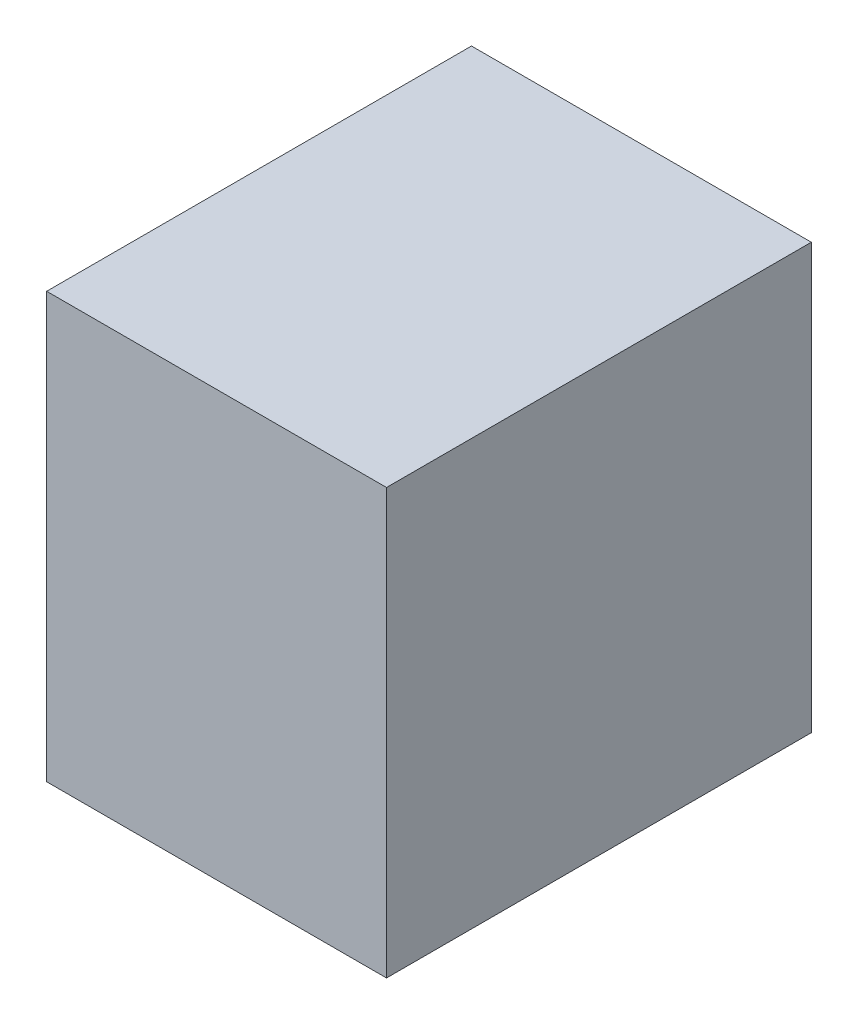
ISO-10303-21;
HEADER;
FILE_DESCRIPTION(('STEP AP214'),'2;1');
FILE_NAME('part.step','',(''),(''),'','','');
FILE_SCHEMA(('AUTOMOTIVE_DESIGN { 1 0 10303 214 1 1 1 1 }'));
ENDSEC;
DATA;
#1=APPLICATION_CONTEXT('core data for automotive mechanical design processes');
#2=APPLICATION_PROTOCOL_DEFINITION('international standard','automotive_design',2000,#1);
#3=PRODUCT_CONTEXT('',#1,'mechanical');
#4=PRODUCT('Part','Part','',(#3));
#5=PRODUCT_RELATED_PRODUCT_CATEGORY('part','',(#4));
#6=PRODUCT_DEFINITION_FORMATION('','',#4);
#7=PRODUCT_DEFINITION_CONTEXT('part definition',#1,'design');
#8=PRODUCT_DEFINITION('design','',#6,#7);
#9=PRODUCT_DEFINITION_SHAPE('','',#8);
#10=(LENGTH_UNIT() NAMED_UNIT(*) SI_UNIT(.MILLI.,.METRE.));
#11=(NAMED_UNIT(*) PLANE_ANGLE_UNIT() SI_UNIT($,.RADIAN.));
#12=(NAMED_UNIT(*) SI_UNIT($,.STERADIAN.) SOLID_ANGLE_UNIT());
#13=UNCERTAINTY_MEASURE_WITH_UNIT(LENGTH_MEASURE(1.E-05),#10,'distance_accuracy_value','');
#14=(GEOMETRIC_REPRESENTATION_CONTEXT(3) GLOBAL_UNCERTAINTY_ASSIGNED_CONTEXT((#13)) GLOBAL_UNIT_ASSIGNED_CONTEXT((#10,
#11,#12)) REPRESENTATION_CONTEXT('',''));
#15=CARTESIAN_POINT('',(0.,0.,0.));
#16=DIRECTION('',(0.,0.,1.));
#17=DIRECTION('',(1.,0.,0.));
#18=AXIS2_PLACEMENT_3D('',#15,#16,#17);
#19=CARTESIAN_POINT('',(-11.0656743384633,50.2483985750425,31.75));
#20=DIRECTION('',(1.,0.,0.));
#21=DIRECTION('',(0.,1.,0.));
#22=AXIS2_PLACEMENT_3D('',#19,#20,#21);
#23=PLANE('',#22);
#24=DIRECTION('',(0.,-1.,0.));
#25=VECTOR('',#24,1.);
#26=CARTESIAN_POINT('',(-11.0656743384633,50.2483985750425,0.));
#27=LINE('',#26,#25);
#28=CARTESIAN_POINT('',(-11.0656743384633,50.2483985750425,0.));
#29=VERTEX_POINT('',#28);
#30=CARTESIAN_POINT('',(-11.0656743384633,18.4983985750425,0.));
#31=VERTEX_POINT('',#30);
#32=EDGE_CURVE('E98',#29,#31,#27,.T.);
#33=ORIENTED_EDGE('',*,*,#32,.T.);
#34=DIRECTION('',(0.,0.,-1.));
#35=VECTOR('',#34,1.);
#36=CARTESIAN_POINT('',(-11.0656743384633,18.4983985750425,31.75));
#37=LINE('',#36,#35);
#38=CARTESIAN_POINT('',(-11.0656743384633,18.4983985750425,31.75));
#39=VERTEX_POINT('',#38);
#40=EDGE_CURVE('E11',#39,#31,#37,.T.);
#41=ORIENTED_EDGE('',*,*,#40,.F.);
#42=DIRECTION('',(0.,-1.,0.));
#43=VECTOR('',#42,1.);
#44=CARTESIAN_POINT('',(-11.0656743384633,50.2483985750425,31.75));
#45=LINE('',#44,#43);
#46=CARTESIAN_POINT('',(-11.0656743384633,50.2483985750425,31.75));
#47=VERTEX_POINT('',#46);
#48=EDGE_CURVE('E86',#47,#39,#45,.T.);
#49=ORIENTED_EDGE('',*,*,#48,.F.);
#50=DIRECTION('',(0.,0.,-1.));
#51=VECTOR('',#50,1.);
#52=CARTESIAN_POINT('',(-11.0656743384633,50.2483985750425,31.75));
#53=LINE('',#52,#51);
#54=EDGE_CURVE('E94',#47,#29,#53,.T.);
#55=ORIENTED_EDGE('',*,*,#54,.T.);
#56=EDGE_LOOP('',(#33,#41,#49,#55));
#57=FACE_BOUND('',#56,.T.);
#58=ADVANCED_FACE('F35',(#57),#23,.F.);
#59=CARTESIAN_POINT('',(-11.0656743384633,18.4983985750425,31.75));
#60=DIRECTION('',(0.,1.,0.));
#61=DIRECTION('',(0.,0.,1.));
#62=AXIS2_PLACEMENT_3D('',#59,#60,#61);
#63=PLANE('',#62);
#64=DIRECTION('',(1.,0.,0.));
#65=VECTOR('',#64,1.);
#66=CARTESIAN_POINT('',(-11.0656743384633,18.4983985750425,0.));
#67=LINE('',#66,#65);
#68=CARTESIAN_POINT('',(14.3343256615367,18.4983985750425,0.));
#69=VERTEX_POINT('',#68);
#70=EDGE_CURVE('E90',#31,#69,#67,.T.);
#71=ORIENTED_EDGE('',*,*,#70,.T.);
#72=DIRECTION('',(0.,0.,-1.));
#73=VECTOR('',#72,1.);
#74=CARTESIAN_POINT('',(14.3343256615367,18.4983985750425,31.75));
#75=LINE('',#74,#73);
#76=CARTESIAN_POINT('',(14.3343256615367,18.4983985750425,31.75));
#77=VERTEX_POINT('',#76);
#78=EDGE_CURVE('E43',#77,#69,#75,.T.);
#79=ORIENTED_EDGE('',*,*,#78,.F.);
#80=DIRECTION('',(1.,0.,0.));
#81=VECTOR('',#80,1.);
#82=CARTESIAN_POINT('',(-11.0656743384633,18.4983985750425,31.75));
#83=LINE('',#82,#81);
#84=EDGE_CURVE('E81',#39,#77,#83,.T.);
#85=ORIENTED_EDGE('',*,*,#84,.F.);
#86=ORIENTED_EDGE('',*,*,#40,.T.);
#87=EDGE_LOOP('',(#71,#79,#85,#86));
#88=FACE_BOUND('',#87,.T.);
#89=ADVANCED_FACE('F89',(#88),#63,.F.);
#90=CARTESIAN_POINT('',(14.3343256615367,50.2483985750425,31.75));
#91=DIRECTION('',(-1.,0.,0.));
#92=DIRECTION('',(0.,-1.,0.));
#93=AXIS2_PLACEMENT_3D('',#90,#91,#92);
#94=PLANE('',#93);
#95=DIRECTION('',(0.,1.,0.));
#96=VECTOR('',#95,1.);
#97=CARTESIAN_POINT('',(14.3343256615367,50.2483985750425,0.));
#98=LINE('',#97,#96);
#99=CARTESIAN_POINT('',(14.3343256615367,50.2483985750425,0.));
#100=VERTEX_POINT('',#99);
#101=EDGE_CURVE('E68',#69,#100,#98,.T.);
#102=ORIENTED_EDGE('',*,*,#101,.T.);
#103=DIRECTION('',(0.,0.,-1.));
#104=VECTOR('',#103,1.);
#105=CARTESIAN_POINT('',(14.3343256615367,50.2483985750425,31.75));
#106=LINE('',#105,#104);
#107=CARTESIAN_POINT('',(14.3343256615367,50.2483985750425,31.75));
#108=VERTEX_POINT('',#107);
#109=EDGE_CURVE('E91',#108,#100,#106,.T.);
#110=ORIENTED_EDGE('',*,*,#109,.F.);
#111=DIRECTION('',(0.,1.,0.));
#112=VECTOR('',#111,1.);
#113=CARTESIAN_POINT('',(14.3343256615367,50.2483985750425,31.75));
#114=LINE('',#113,#112);
#115=EDGE_CURVE('E84',#77,#108,#114,.T.);
#116=ORIENTED_EDGE('',*,*,#115,.F.);
#117=ORIENTED_EDGE('',*,*,#78,.T.);
#118=EDGE_LOOP('',(#102,#110,#116,#117));
#119=FACE_BOUND('',#118,.T.);
#120=ADVANCED_FACE('F92',(#119),#94,.F.);
#121=CARTESIAN_POINT('',(-11.0656743384633,50.2483985750425,31.75));
#122=DIRECTION('',(0.,-1.,0.));
#123=DIRECTION('',(0.,0.,-1.));
#124=AXIS2_PLACEMENT_3D('',#121,#122,#123);
#125=PLANE('',#124);
#126=DIRECTION('',(-1.,0.,0.));
#127=VECTOR('',#126,1.);
#128=CARTESIAN_POINT('',(-11.0656743384633,50.2483985750425,0.));
#129=LINE('',#128,#127);
#130=EDGE_CURVE('E74',#100,#29,#129,.T.);
#131=ORIENTED_EDGE('',*,*,#130,.T.);
#132=ORIENTED_EDGE('',*,*,#54,.F.);
#133=DIRECTION('',(-1.,0.,0.));
#134=VECTOR('',#133,1.);
#135=CARTESIAN_POINT('',(-11.0656743384633,50.2483985750425,31.75));
#136=LINE('',#135,#134);
#137=EDGE_CURVE('E51',#108,#47,#136,.T.);
#138=ORIENTED_EDGE('',*,*,#137,.F.);
#139=ORIENTED_EDGE('',*,*,#109,.T.);
#140=EDGE_LOOP('',(#131,#132,#138,#139));
#141=FACE_BOUND('',#140,.T.);
#142=ADVANCED_FACE('F105',(#141),#125,.F.);
#143=CARTESIAN_POINT('',(0.,0.,31.75));
#144=DIRECTION('',(0.,0.,1.));
#145=DIRECTION('',(1.,0.,0.));
#146=AXIS2_PLACEMENT_3D('',#143,#144,#145);
#147=PLANE('',#146);
#148=ORIENTED_EDGE('',*,*,#48,.T.);
#149=ORIENTED_EDGE('',*,*,#84,.T.);
#150=ORIENTED_EDGE('',*,*,#115,.T.);
#151=ORIENTED_EDGE('',*,*,#137,.T.);
#152=EDGE_LOOP('',(#148,#149,#150,#151));
#153=FACE_BOUND('',#152,.T.);
#154=ADVANCED_FACE('F82',(#153),#147,.T.);
#155=CARTESIAN_POINT('',(0.,0.,0.));
#156=DIRECTION('',(0.,0.,1.));
#157=DIRECTION('',(1.,0.,0.));
#158=AXIS2_PLACEMENT_3D('',#155,#156,#157);
#159=PLANE('',#158);
#160=ORIENTED_EDGE('',*,*,#32,.F.);
#161=ORIENTED_EDGE('',*,*,#130,.F.);
#162=ORIENTED_EDGE('',*,*,#101,.F.);
#163=ORIENTED_EDGE('',*,*,#70,.F.);
#164=EDGE_LOOP('',(#160,#161,#162,#163));
#165=FACE_BOUND('',#164,.T.);
#166=ADVANCED_FACE('F108',(#165),#159,.F.);
#167=CLOSED_SHELL('',(#58,#89,#120,#142,#154,#166));
#168=MANIFOLD_SOLID_BREP('B2',#167);
#169=ADVANCED_BREP_SHAPE_REPRESENTATION('',(#18,#168),#14);
#170=SHAPE_DEFINITION_REPRESENTATION(#9,#169);
ENDSEC;
END-ISO-10303-21;
